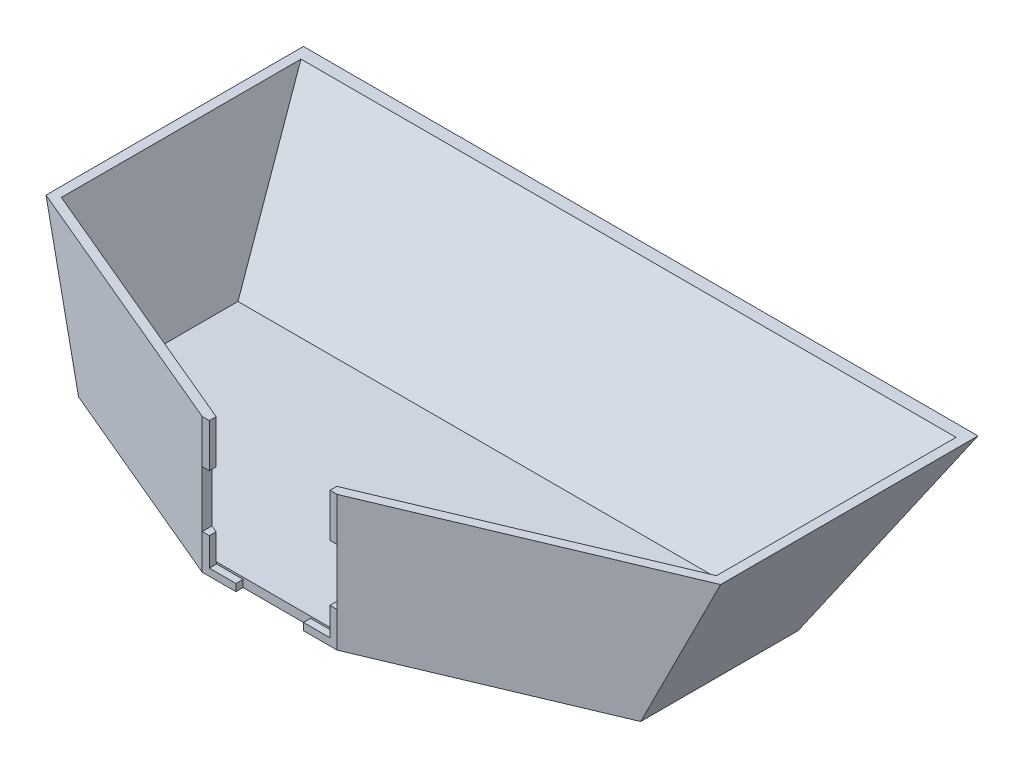
ISO-10303-21;
HEADER;
FILE_DESCRIPTION(('STEP AP214'),'2;1');
FILE_NAME('part.step','',(''),(''),'','','');
FILE_SCHEMA(('AUTOMOTIVE_DESIGN { 1 0 10303 214 1 1 1 1 }'));
ENDSEC;
DATA;
#1=APPLICATION_CONTEXT('core data for automotive mechanical design processes');
#2=APPLICATION_PROTOCOL_DEFINITION('international standard','automotive_design',2000,#1);
#3=PRODUCT_CONTEXT('',#1,'mechanical');
#4=PRODUCT('Part','Part','',(#3));
#5=PRODUCT_RELATED_PRODUCT_CATEGORY('part','',(#4));
#6=PRODUCT_DEFINITION_FORMATION('','',#4);
#7=PRODUCT_DEFINITION_CONTEXT('part definition',#1,'design');
#8=PRODUCT_DEFINITION('design','',#6,#7);
#9=PRODUCT_DEFINITION_SHAPE('','',#8);
#10=(LENGTH_UNIT() NAMED_UNIT(*) SI_UNIT(.MILLI.,.METRE.));
#11=(NAMED_UNIT(*) PLANE_ANGLE_UNIT() SI_UNIT($,.RADIAN.));
#12=(NAMED_UNIT(*) SI_UNIT($,.STERADIAN.) SOLID_ANGLE_UNIT());
#13=UNCERTAINTY_MEASURE_WITH_UNIT(LENGTH_MEASURE(1.E-05),#10,'distance_accuracy_value','');
#14=(GEOMETRIC_REPRESENTATION_CONTEXT(3) GLOBAL_UNCERTAINTY_ASSIGNED_CONTEXT((#13)) GLOBAL_UNIT_ASSIGNED_CONTEXT((#10,
#11,#12)) REPRESENTATION_CONTEXT('',''));
#15=CARTESIAN_POINT('',(0.,0.,0.));
#16=DIRECTION('',(0.,0.,1.));
#17=DIRECTION('',(1.,0.,0.));
#18=AXIS2_PLACEMENT_3D('',#15,#16,#17);
#19=CARTESIAN_POINT('',(0.,0.,75.));
#20=DIRECTION('',(0.,0.,1.));
#21=DIRECTION('',(1.,0.,0.));
#22=AXIS2_PLACEMENT_3D('',#19,#20,#21);
#23=PLANE('',#22);
#24=DIRECTION('',(-1.,0.,0.));
#25=VECTOR('',#24,1.);
#26=CARTESIAN_POINT('',(-26.825,40.675,75.));
#27=LINE('',#26,#25);
#28=CARTESIAN_POINT('',(-26.825,40.675,75.));
#29=VERTEX_POINT('',#28);
#30=CARTESIAN_POINT('',(-30.,40.675,75.));
#31=VERTEX_POINT('',#30);
#32=EDGE_CURVE('E338',#29,#31,#27,.T.);
#33=ORIENTED_EDGE('',*,*,#32,.F.);
#34=DIRECTION('',(0.,-1.,0.));
#35=VECTOR('',#34,1.);
#36=CARTESIAN_POINT('',(-26.825,40.675,75.));
#37=LINE('',#36,#35);
#38=CARTESIAN_POINT('',(-26.825,60.,75.));
#39=VERTEX_POINT('',#38);
#40=EDGE_CURVE('E343',#39,#29,#37,.T.);
#41=ORIENTED_EDGE('',*,*,#40,.F.);
#42=DIRECTION('',(1.,0.,0.));
#43=VECTOR('',#42,1.);
#44=CARTESIAN_POINT('',(-30.,60.,75.));
#45=LINE('',#44,#43);
#46=CARTESIAN_POINT('',(-30.,60.,75.));
#47=VERTEX_POINT('',#46);
#48=EDGE_CURVE('E670',#47,#39,#45,.T.);
#49=ORIENTED_EDGE('',*,*,#48,.F.);
#50=DIRECTION('',(0.,-1.,0.));
#51=VECTOR('',#50,1.);
#52=CARTESIAN_POINT('',(-30.,60.,75.));
#53=LINE('',#52,#51);
#54=EDGE_CURVE('E472',#47,#31,#53,.T.);
#55=ORIENTED_EDGE('',*,*,#54,.T.);
#56=EDGE_LOOP('',(#33,#41,#49,#55));
#57=FACE_BOUND('',#56,.T.);
#58=ADVANCED_FACE('F53',(#57),#23,.T.);
#59=DIRECTION('',(0.,1.,0.));
#60=VECTOR('',#59,1.);
#61=CARTESIAN_POINT('',(26.825,40.675,75.));
#62=LINE('',#61,#60);
#63=CARTESIAN_POINT('',(26.825,40.675,75.));
#64=VERTEX_POINT('',#63);
#65=CARTESIAN_POINT('',(26.825,60.,75.));
#66=VERTEX_POINT('',#65);
#67=EDGE_CURVE('E337',#64,#66,#62,.T.);
#68=ORIENTED_EDGE('',*,*,#67,.F.);
#69=DIRECTION('',(-1.,0.,0.));
#70=VECTOR('',#69,1.);
#71=CARTESIAN_POINT('',(26.825,40.675,75.));
#72=LINE('',#71,#70);
#73=CARTESIAN_POINT('',(30.,40.675,75.));
#74=VERTEX_POINT('',#73);
#75=EDGE_CURVE('E333',#74,#64,#72,.T.);
#76=ORIENTED_EDGE('',*,*,#75,.F.);
#77=DIRECTION('',(0.,-1.,0.));
#78=VECTOR('',#77,1.);
#79=CARTESIAN_POINT('',(30.,60.,75.));
#80=LINE('',#79,#78);
#81=CARTESIAN_POINT('',(30.,60.,75.));
#82=VERTEX_POINT('',#81);
#83=EDGE_CURVE('E473',#82,#74,#80,.T.);
#84=ORIENTED_EDGE('',*,*,#83,.F.);
#85=EDGE_CURVE('E58',#66,#82,#45,.T.);
#86=ORIENTED_EDGE('',*,*,#85,.F.);
#87=EDGE_LOOP('',(#68,#76,#84,#86));
#88=FACE_BOUND('',#87,.T.);
#89=ADVANCED_FACE('F859',(#88),#23,.T.);
#90=DIRECTION('',(1.,0.,0.));
#91=VECTOR('',#90,1.);
#92=CARTESIAN_POINT('',(26.825,15.675,75.));
#93=LINE('',#92,#91);
#94=CARTESIAN_POINT('',(26.825,15.675,75.));
#95=VERTEX_POINT('',#94);
#96=CARTESIAN_POINT('',(30.,15.675,75.));
#97=VERTEX_POINT('',#96);
#98=EDGE_CURVE('E264',#95,#97,#93,.T.);
#99=ORIENTED_EDGE('',*,*,#98,.F.);
#100=DIRECTION('',(0.,1.,0.));
#101=VECTOR('',#100,1.);
#102=CARTESIAN_POINT('',(26.825,3.175,75.));
#103=LINE('',#102,#101);
#104=CARTESIAN_POINT('',(26.825,3.175,75.));
#105=VERTEX_POINT('',#104);
#106=EDGE_CURVE('E323',#105,#95,#103,.T.);
#107=ORIENTED_EDGE('',*,*,#106,.F.);
#108=DIRECTION('',(1.,0.,0.));
#109=VECTOR('',#108,1.);
#110=CARTESIAN_POINT('',(15.,3.175,75.));
#111=LINE('',#110,#109);
#112=CARTESIAN_POINT('',(15.,3.175,75.));
#113=VERTEX_POINT('',#112);
#114=EDGE_CURVE('E319',#113,#105,#111,.T.);
#115=ORIENTED_EDGE('',*,*,#114,.F.);
#116=DIRECTION('',(0.,1.,0.));
#117=VECTOR('',#116,1.);
#118=CARTESIAN_POINT('',(15.,0.,75.));
#119=LINE('',#118,#117);
#120=CARTESIAN_POINT('',(15.,0.,75.));
#121=VERTEX_POINT('',#120);
#122=EDGE_CURVE('E324',#121,#113,#119,.T.);
#123=ORIENTED_EDGE('',*,*,#122,.F.);
#124=DIRECTION('',(1.,0.,0.));
#125=VECTOR('',#124,1.);
#126=CARTESIAN_POINT('',(-30.,0.,75.));
#127=LINE('',#126,#125);
#128=CARTESIAN_POINT('',(30.0000000000001,0.,75.));
#129=VERTEX_POINT('',#128);
#130=EDGE_CURVE('E726',#121,#129,#127,.T.);
#131=ORIENTED_EDGE('',*,*,#130,.T.);
#132=EDGE_CURVE('E578',#97,#129,#80,.T.);
#133=ORIENTED_EDGE('',*,*,#132,.F.);
#134=EDGE_LOOP('',(#99,#107,#115,#123,#131,#133));
#135=FACE_BOUND('',#134,.T.);
#136=ADVANCED_FACE('F863',(#135),#23,.T.);
#137=CARTESIAN_POINT('',(0.,0.,0.));
#138=DIRECTION('',(0.,1.,0.));
#139=DIRECTION('',(0.,0.,1.));
#140=AXIS2_PLACEMENT_3D('',#137,#138,#139);
#141=PLANE('',#140);
#142=ORIENTED_EDGE('',*,*,#130,.F.);
#143=DIRECTION('',(0.,0.,1.));
#144=VECTOR('',#143,1.);
#145=CARTESIAN_POINT('',(15.,0.,71.825));
#146=LINE('',#145,#144);
#147=CARTESIAN_POINT('',(15.,0.,71.825));
#148=VERTEX_POINT('',#147);
#149=EDGE_CURVE('E378',#148,#121,#146,.T.);
#150=ORIENTED_EDGE('',*,*,#149,.F.);
#151=DIRECTION('',(1.,0.,0.));
#152=VECTOR('',#151,1.);
#153=CARTESIAN_POINT('',(-15.,0.,71.825));
#154=LINE('',#153,#152);
#155=CARTESIAN_POINT('',(-15.,0.,71.825));
#156=VERTEX_POINT('',#155);
#157=EDGE_CURVE('E294',#156,#148,#154,.T.);
#158=ORIENTED_EDGE('',*,*,#157,.F.);
#159=DIRECTION('',(0.,0.,1.));
#160=VECTOR('',#159,1.);
#161=CARTESIAN_POINT('',(-15.,0.,71.825));
#162=LINE('',#161,#160);
#163=CARTESIAN_POINT('',(-15.,0.,75.));
#164=VERTEX_POINT('',#163);
#165=EDGE_CURVE('E382',#156,#164,#162,.T.);
#166=ORIENTED_EDGE('',*,*,#165,.T.);
#167=CARTESIAN_POINT('',(-30.,0.,75.));
#168=VERTEX_POINT('',#167);
#169=EDGE_CURVE('E614',#168,#164,#127,.T.);
#170=ORIENTED_EDGE('',*,*,#169,.F.);
#171=DIRECTION('',(0.921635375138065,0.,0.388057000058133));
#172=VECTOR('',#171,1.);
#173=CARTESIAN_POINT('',(-125.,0.,35.));
#174=LINE('',#173,#172);
#175=CARTESIAN_POINT('',(-125.,0.,35.));
#176=VERTEX_POINT('',#175);
#177=EDGE_CURVE('E73',#176,#168,#174,.T.);
#178=ORIENTED_EDGE('',*,*,#177,.F.);
#179=DIRECTION('',(0.,0.,1.));
#180=VECTOR('',#179,1.);
#181=CARTESIAN_POINT('',(-125.,0.,35.));
#182=LINE('',#181,#180);
#183=CARTESIAN_POINT('',(-125.,0.,-35.));
#184=VERTEX_POINT('',#183);
#185=EDGE_CURVE('E831',#184,#176,#182,.T.);
#186=ORIENTED_EDGE('',*,*,#185,.F.);
#187=DIRECTION('',(-1.,0.,0.));
#188=VECTOR('',#187,1.);
#189=CARTESIAN_POINT('',(125.,0.,-35.));
#190=LINE('',#189,#188);
#191=CARTESIAN_POINT('',(125.,0.,-35.));
#192=VERTEX_POINT('',#191);
#193=EDGE_CURVE('E526',#192,#184,#190,.T.);
#194=ORIENTED_EDGE('',*,*,#193,.F.);
#195=DIRECTION('',(0.,0.,-1.));
#196=VECTOR('',#195,1.);
#197=CARTESIAN_POINT('',(125.,0.,35.));
#198=LINE('',#197,#196);
#199=CARTESIAN_POINT('',(125.,0.,35.));
#200=VERTEX_POINT('',#199);
#201=EDGE_CURVE('E750',#200,#192,#198,.T.);
#202=ORIENTED_EDGE('',*,*,#201,.F.);
#203=DIRECTION('',(0.921635375138065,0.,-0.388057000058133));
#204=VECTOR('',#203,1.);
#205=CARTESIAN_POINT('',(125.,0.,35.));
#206=LINE('',#205,#204);
#207=EDGE_CURVE('E744',#129,#200,#206,.T.);
#208=ORIENTED_EDGE('',*,*,#207,.F.);
#209=EDGE_LOOP('',(#142,#150,#158,#166,#170,#178,#186,#194,#202,#208));
#210=FACE_BOUND('',#209,.T.);
#211=ADVANCED_FACE('F55',(#210),#141,.F.);
#212=CARTESIAN_POINT('',(0.,60.,0.));
#213=DIRECTION('',(0.,1.,0.));
#214=DIRECTION('',(0.,0.,1.));
#215=AXIS2_PLACEMENT_3D('',#212,#213,#214);
#216=PLANE('',#215);
#217=DIRECTION('',(0.,0.,1.));
#218=VECTOR('',#217,1.);
#219=CARTESIAN_POINT('',(-26.825,60.,71.825));
#220=LINE('',#219,#218);
#221=CARTESIAN_POINT('',(-26.825,60.,71.9967309204025));
#222=VERTEX_POINT('',#221);
#223=EDGE_CURVE('E363',#222,#39,#220,.T.);
#224=ORIENTED_EDGE('',*,*,#223,.F.);
#225=DIRECTION('',(0.921635375138065,0.,0.388057000058133));
#226=VECTOR('',#225,1.);
#227=CARTESIAN_POINT('',(-29.7889484703557,60.,70.7487526170948));
#228=LINE('',#227,#226);
#229=CARTESIAN_POINT('',(-145.666666666667,60.,21.9581344291744));
#230=VERTEX_POINT('',#229);
#231=EDGE_CURVE('E418',#230,#222,#228,.T.);
#232=ORIENTED_EDGE('',*,*,#231,.F.);
#233=DIRECTION('',(0.,0.,1.));
#234=VECTOR('',#233,1.);
#235=CARTESIAN_POINT('',(-145.666666666667,60.,0.));
#236=LINE('',#235,#234);
#237=CARTESIAN_POINT('',(-145.666666666667,60.,-84.5737264679667));
#238=VERTEX_POINT('',#237);
#239=EDGE_CURVE('E437',#238,#230,#236,.T.);
#240=ORIENTED_EDGE('',*,*,#239,.F.);
#241=DIRECTION('',(-1.,0.,0.));
#242=VECTOR('',#241,1.);
#243=CARTESIAN_POINT('',(0.,60.,-84.5737264679667));
#244=LINE('',#243,#242);
#245=CARTESIAN_POINT('',(145.666666666667,60.,-84.5737264679668));
#246=VERTEX_POINT('',#245);
#247=EDGE_CURVE('E433',#246,#238,#244,.T.);
#248=ORIENTED_EDGE('',*,*,#247,.F.);
#249=DIRECTION('',(0.,0.,-1.));
#250=VECTOR('',#249,1.);
#251=CARTESIAN_POINT('',(145.666666666667,60.,0.));
#252=LINE('',#251,#250);
#253=CARTESIAN_POINT('',(145.666666666667,60.,21.9581344291744));
#254=VERTEX_POINT('',#253);
#255=EDGE_CURVE('E429',#254,#246,#252,.T.);
#256=ORIENTED_EDGE('',*,*,#255,.F.);
#257=DIRECTION('',(0.921635375138065,0.,-0.388057000058133));
#258=VECTOR('',#257,1.);
#259=CARTESIAN_POINT('',(29.7889484703557,60.,70.7487526170948));
#260=LINE('',#259,#258);
#261=CARTESIAN_POINT('',(26.825,60.,71.9967309204025));
#262=VERTEX_POINT('',#261);
#263=EDGE_CURVE('E394',#262,#254,#260,.T.);
#264=ORIENTED_EDGE('',*,*,#263,.F.);
#265=DIRECTION('',(0.,0.,1.));
#266=VECTOR('',#265,1.);
#267=CARTESIAN_POINT('',(26.825,60.,71.825));
#268=LINE('',#267,#266);
#269=EDGE_CURVE('E367',#262,#66,#268,.T.);
#270=ORIENTED_EDGE('',*,*,#269,.T.);
#271=ORIENTED_EDGE('',*,*,#85,.T.);
#272=DIRECTION('',(0.921635375138065,0.,-0.388057000058133));
#273=VECTOR('',#272,1.);
#274=CARTESIAN_POINT('',(30.,60.,75.));
#275=LINE('',#274,#273);
#276=CARTESIAN_POINT('',(150.,60.,24.4736842105263));
#277=VERTEX_POINT('',#276);
#278=EDGE_CURVE('E586',#82,#277,#275,.T.);
#279=ORIENTED_EDGE('',*,*,#278,.T.);
#280=DIRECTION('',(0.,0.,-1.));
#281=VECTOR('',#280,1.);
#282=CARTESIAN_POINT('',(150.,60.,24.4736842105263));
#283=LINE('',#282,#281);
#284=CARTESIAN_POINT('',(150.,60.,-90.));
#285=VERTEX_POINT('',#284);
#286=EDGE_CURVE('E566',#277,#285,#283,.T.);
#287=ORIENTED_EDGE('',*,*,#286,.T.);
#288=DIRECTION('',(-1.,0.,0.));
#289=VECTOR('',#288,1.);
#290=CARTESIAN_POINT('',(-150.,60.,-90.));
#291=LINE('',#290,#289);
#292=CARTESIAN_POINT('',(-150.,60.,-90.));
#293=VERTEX_POINT('',#292);
#294=EDGE_CURVE('E647',#285,#293,#291,.T.);
#295=ORIENTED_EDGE('',*,*,#294,.T.);
#296=DIRECTION('',(0.,0.,1.));
#297=VECTOR('',#296,1.);
#298=CARTESIAN_POINT('',(-150.,60.,24.4736842105264));
#299=LINE('',#298,#297);
#300=CARTESIAN_POINT('',(-150.,60.,24.4736842105264));
#301=VERTEX_POINT('',#300);
#302=EDGE_CURVE('E486',#293,#301,#299,.T.);
#303=ORIENTED_EDGE('',*,*,#302,.T.);
#304=DIRECTION('',(0.921635375138065,0.,0.388057000058133));
#305=VECTOR('',#304,1.);
#306=CARTESIAN_POINT('',(-30.,60.,75.));
#307=LINE('',#306,#305);
#308=EDGE_CURVE('E629',#301,#47,#307,.T.);
#309=ORIENTED_EDGE('',*,*,#308,.T.);
#310=ORIENTED_EDGE('',*,*,#48,.T.);
#311=EDGE_LOOP('',(#224,#232,#240,#248,#256,#264,#270,#271,#279,#287,#295,#303,#309,#310));
#312=FACE_BOUND('',#311,.T.);
#313=ADVANCED_FACE('F505',(#312),#216,.T.);
#314=CARTESIAN_POINT('',(-106.508875739645,-44.3786982248521,0.));
#315=DIRECTION('',(-0.923076923076923,-0.384615384615385,0.));
#316=DIRECTION('',(0.384615384615385,-0.923076923076923,0.));
#317=AXIS2_PLACEMENT_3D('',#314,#315,#316);
#318=PLANE('',#317);
#319=DIRECTION('',(0.293610109757352,-0.704664263417644,0.645942241466174));
#320=VECTOR('',#319,1.);
#321=CARTESIAN_POINT('',(-150.,60.,-90.));
#322=LINE('',#321,#320);
#323=EDGE_CURVE('E492',#293,#184,#322,.T.);
#324=ORIENTED_EDGE('',*,*,#323,.T.);
#325=ORIENTED_EDGE('',*,*,#185,.T.);
#326=DIRECTION('',(0.379669072789938,-0.91120577469585,0.159860662227342));
#327=VECTOR('',#326,1.);
#328=CARTESIAN_POINT('',(-150.,60.,24.4736842105264));
#329=LINE('',#328,#327);
#330=EDGE_CURVE('E558',#301,#176,#329,.T.);
#331=ORIENTED_EDGE('',*,*,#330,.F.);
#332=ORIENTED_EDGE('',*,*,#302,.F.);
#333=EDGE_LOOP('',(#324,#325,#331,#332));
#334=FACE_BOUND('',#333,.T.);
#335=ADVANCED_FACE('F494',(#334),#318,.T.);
#336=CARTESIAN_POINT('',(-31.3411764705882,0.,74.4352941176471));
#337=DIRECTION('',(-0.388057000058133,0.,0.921635375138065));
#338=DIRECTION('',(0.921635375138065,0.,0.388057000058133));
#339=AXIS2_PLACEMENT_3D('',#336,#337,#338);
#340=PLANE('',#339);
#341=ORIENTED_EDGE('',*,*,#330,.T.);
#342=ORIENTED_EDGE('',*,*,#177,.T.);
#343=CARTESIAN_POINT('',(-30.,15.675,75.));
#344=VERTEX_POINT('',#343);
#345=EDGE_CURVE('E82',#344,#168,#53,.T.);
#346=ORIENTED_EDGE('',*,*,#345,.F.);
#347=DIRECTION('',(0.,-1.,0.));
#348=VECTOR('',#347,1.);
#349=CARTESIAN_POINT('',(-30.,15.675,75.));
#350=LINE('',#349,#348);
#351=EDGE_CURVE('E342',#31,#344,#350,.T.);
#352=ORIENTED_EDGE('',*,*,#351,.F.);
#353=ORIENTED_EDGE('',*,*,#54,.F.);
#354=ORIENTED_EDGE('',*,*,#308,.F.);
#355=EDGE_LOOP('',(#341,#342,#346,#352,#353,#354));
#356=FACE_BOUND('',#355,.T.);
#357=ADVANCED_FACE('F504',(#356),#340,.T.);
#358=CARTESIAN_POINT('',(0.,-17.4339622641509,-19.0188679245283));
#359=DIRECTION('',(0.,-0.675724628517346,-0.737154140200742));
#360=DIRECTION('',(0.,0.737154140200742,-0.675724628517346));
#361=AXIS2_PLACEMENT_3D('',#358,#359,#360);
#362=PLANE('',#361);
#363=DIRECTION('',(-0.293610109757351,-0.704664263417644,0.645942241466174));
#364=VECTOR('',#363,1.);
#365=CARTESIAN_POINT('',(150.,60.,-90.));
#366=LINE('',#365,#364);
#367=EDGE_CURVE('E549',#285,#192,#366,.T.);
#368=ORIENTED_EDGE('',*,*,#367,.T.);
#369=ORIENTED_EDGE('',*,*,#193,.T.);
#370=ORIENTED_EDGE('',*,*,#323,.F.);
#371=ORIENTED_EDGE('',*,*,#294,.F.);
#372=EDGE_LOOP('',(#368,#369,#370,#371));
#373=FACE_BOUND('',#372,.T.);
#374=ADVANCED_FACE('F531',(#373),#362,.T.);
#375=CARTESIAN_POINT('',(106.508875739645,-44.3786982248521,0.));
#376=DIRECTION('',(0.923076923076923,-0.384615384615385,0.));
#377=DIRECTION('',(0.384615384615385,0.923076923076923,0.));
#378=AXIS2_PLACEMENT_3D('',#375,#376,#377);
#379=PLANE('',#378);
#380=DIRECTION('',(-0.379669072789938,-0.91120577469585,0.159860662227343));
#381=VECTOR('',#380,1.);
#382=CARTESIAN_POINT('',(150.,60.,24.4736842105263));
#383=LINE('',#382,#381);
#384=EDGE_CURVE('E557',#277,#200,#383,.T.);
#385=ORIENTED_EDGE('',*,*,#384,.T.);
#386=ORIENTED_EDGE('',*,*,#201,.T.);
#387=ORIENTED_EDGE('',*,*,#367,.F.);
#388=ORIENTED_EDGE('',*,*,#286,.F.);
#389=EDGE_LOOP('',(#385,#386,#387,#388));
#390=FACE_BOUND('',#389,.T.);
#391=ADVANCED_FACE('F540',(#390),#379,.T.);
#392=CARTESIAN_POINT('',(31.3411764705883,0.,74.4352941176471));
#393=DIRECTION('',(0.388057000058133,0.,0.921635375138065));
#394=DIRECTION('',(0.921635375138065,0.,-0.388057000058133));
#395=AXIS2_PLACEMENT_3D('',#392,#393,#394);
#396=PLANE('',#395);
#397=ORIENTED_EDGE('',*,*,#83,.T.);
#398=DIRECTION('',(0.,1.,0.));
#399=VECTOR('',#398,1.);
#400=CARTESIAN_POINT('',(30.,15.675,75.));
#401=LINE('',#400,#399);
#402=EDGE_CURVE('E330',#97,#74,#401,.T.);
#403=ORIENTED_EDGE('',*,*,#402,.F.);
#404=ORIENTED_EDGE('',*,*,#132,.T.);
#405=ORIENTED_EDGE('',*,*,#207,.T.);
#406=ORIENTED_EDGE('',*,*,#384,.F.);
#407=ORIENTED_EDGE('',*,*,#278,.F.);
#408=EDGE_LOOP('',(#397,#403,#404,#405,#406,#407));
#409=FACE_BOUND('',#408,.T.);
#410=ADVANCED_FACE('F592',(#409),#396,.T.);
#411=DIRECTION('',(1.,0.,0.));
#412=VECTOR('',#411,1.);
#413=CARTESIAN_POINT('',(-26.825,15.675,75.));
#414=LINE('',#413,#412);
#415=CARTESIAN_POINT('',(-26.825,15.675,75.));
#416=VERTEX_POINT('',#415);
#417=EDGE_CURVE('E286',#344,#416,#414,.T.);
#418=ORIENTED_EDGE('',*,*,#417,.F.);
#419=ORIENTED_EDGE('',*,*,#345,.T.);
#420=ORIENTED_EDGE('',*,*,#169,.T.);
#421=DIRECTION('',(0.,-1.,0.));
#422=VECTOR('',#421,1.);
#423=CARTESIAN_POINT('',(-15.,0.,75.));
#424=LINE('',#423,#422);
#425=CARTESIAN_POINT('',(-15.,3.175,75.));
#426=VERTEX_POINT('',#425);
#427=EDGE_CURVE('E318',#426,#164,#424,.T.);
#428=ORIENTED_EDGE('',*,*,#427,.F.);
#429=DIRECTION('',(1.,0.,0.));
#430=VECTOR('',#429,1.);
#431=CARTESIAN_POINT('',(-26.825,3.175,75.));
#432=LINE('',#431,#430);
#433=CARTESIAN_POINT('',(-26.825,3.175,75.));
#434=VERTEX_POINT('',#433);
#435=EDGE_CURVE('E314',#434,#426,#432,.T.);
#436=ORIENTED_EDGE('',*,*,#435,.F.);
#437=DIRECTION('',(0.,-1.,0.));
#438=VECTOR('',#437,1.);
#439=CARTESIAN_POINT('',(-26.825,3.175,75.));
#440=LINE('',#439,#438);
#441=EDGE_CURVE('E279',#416,#434,#440,.T.);
#442=ORIENTED_EDGE('',*,*,#441,.F.);
#443=EDGE_LOOP('',(#418,#419,#420,#428,#436,#442));
#444=FACE_BOUND('',#443,.T.);
#445=ADVANCED_FACE('F600',(#444),#23,.T.);
#446=CARTESIAN_POINT('',(0.,4.,0.));
#447=DIRECTION('',(0.,1.,0.));
#448=DIRECTION('',(0.,0.,1.));
#449=AXIS2_PLACEMENT_3D('',#446,#447,#448);
#450=PLANE('',#449);
#451=DIRECTION('',(0.,0.,1.));
#452=VECTOR('',#451,1.);
#453=CARTESIAN_POINT('',(-26.825,4.,0.));
#454=LINE('',#453,#452);
#455=CARTESIAN_POINT('',(-26.825,4.,71.825));
#456=VERTEX_POINT('',#455);
#457=CARTESIAN_POINT('',(-26.825,4.,71.9967309204025));
#458=VERTEX_POINT('',#457);
#459=EDGE_CURVE('E391',#456,#458,#454,.T.);
#460=ORIENTED_EDGE('',*,*,#459,.F.);
#461=DIRECTION('',(1.,0.,0.));
#462=VECTOR('',#461,1.);
#463=CARTESIAN_POINT('',(0.,4.,71.825));
#464=LINE('',#463,#462);
#465=CARTESIAN_POINT('',(26.825,4.,71.825));
#466=VERTEX_POINT('',#465);
#467=EDGE_CURVE('E353',#456,#466,#464,.T.);
#468=ORIENTED_EDGE('',*,*,#467,.T.);
#469=DIRECTION('',(0.,0.,-1.));
#470=VECTOR('',#469,1.);
#471=CARTESIAN_POINT('',(26.825,4.,0.));
#472=LINE('',#471,#470);
#473=CARTESIAN_POINT('',(26.825,4.,71.9967309204025));
#474=VERTEX_POINT('',#473);
#475=EDGE_CURVE('E388',#474,#466,#472,.T.);
#476=ORIENTED_EDGE('',*,*,#475,.F.);
#477=DIRECTION('',(0.921635375138065,0.,-0.388057000058133));
#478=VECTOR('',#477,1.);
#479=CARTESIAN_POINT('',(29.7889484703558,4.,70.7487526170949));
#480=LINE('',#479,#478);
#481=CARTESIAN_POINT('',(122.333333333333,4.,31.7826958326832));
#482=VERTEX_POINT('',#481);
#483=EDGE_CURVE('E406',#474,#482,#480,.T.);
#484=ORIENTED_EDGE('',*,*,#483,.T.);
#485=DIRECTION('',(0.,0.,-1.));
#486=VECTOR('',#485,1.);
#487=CARTESIAN_POINT('',(122.333333333333,4.,0.));
#488=LINE('',#487,#486);
#489=CARTESIAN_POINT('',(122.333333333333,4.,-33.2403931346334));
#490=VERTEX_POINT('',#489);
#491=EDGE_CURVE('E403',#482,#490,#488,.T.);
#492=ORIENTED_EDGE('',*,*,#491,.T.);
#493=DIRECTION('',(-1.,0.,0.));
#494=VECTOR('',#493,1.);
#495=CARTESIAN_POINT('',(0.,4.,-33.2403931346334));
#496=LINE('',#495,#494);
#497=CARTESIAN_POINT('',(-122.333333333333,4.,-33.2403931346334));
#498=VERTEX_POINT('',#497);
#499=EDGE_CURVE('E399',#490,#498,#496,.T.);
#500=ORIENTED_EDGE('',*,*,#499,.T.);
#501=DIRECTION('',(0.,0.,1.));
#502=VECTOR('',#501,1.);
#503=CARTESIAN_POINT('',(-122.333333333333,4.,0.));
#504=LINE('',#503,#502);
#505=CARTESIAN_POINT('',(-122.333333333333,4.,31.7826958326832));
#506=VERTEX_POINT('',#505);
#507=EDGE_CURVE('E395',#498,#506,#504,.T.);
#508=ORIENTED_EDGE('',*,*,#507,.T.);
#509=DIRECTION('',(0.921635375138065,0.,0.388057000058133));
#510=VECTOR('',#509,1.);
#511=CARTESIAN_POINT('',(-29.7889484703557,4.,70.7487526170948));
#512=LINE('',#511,#510);
#513=EDGE_CURVE('E409',#506,#458,#512,.T.);
#514=ORIENTED_EDGE('',*,*,#513,.T.);
#515=EDGE_LOOP('',(#460,#468,#476,#484,#492,#500,#508,#514));
#516=FACE_BOUND('',#515,.T.);
#517=ADVANCED_FACE('F865',(#516),#450,.T.);
#518=CARTESIAN_POINT('',(-102.816568047337,-42.8402366863905,0.));
#519=DIRECTION('',(-0.923076923076923,-0.384615384615385,0.));
#520=DIRECTION('',(0.384615384615385,-0.923076923076923,0.));
#521=AXIS2_PLACEMENT_3D('',#518,#519,#520);
#522=PLANE('',#521);
#523=DIRECTION('',(0.293610109757352,-0.704664263417644,0.645942241466174));
#524=VECTOR('',#523,1.);
#525=CARTESIAN_POINT('',(-104.655557623891,-38.4266617026607,5.65071342613892));
#526=LINE('',#525,#524);
#527=EDGE_CURVE('E413',#238,#498,#526,.T.);
#528=ORIENTED_EDGE('',*,*,#527,.F.);
#529=ORIENTED_EDGE('',*,*,#239,.T.);
#530=DIRECTION('',(0.379669072789938,-0.91120577469585,0.159860662227342));
#531=VECTOR('',#530,1.);
#532=CARTESIAN_POINT('',(-105.244351091657,-37.0135573800241,38.9780567765471));
#533=LINE('',#532,#531);
#534=EDGE_CURVE('E417',#230,#506,#533,.T.);
#535=ORIENTED_EDGE('',*,*,#534,.T.);
#536=ORIENTED_EDGE('',*,*,#507,.F.);
#537=EDGE_LOOP('',(#528,#529,#535,#536));
#538=FACE_BOUND('',#537,.T.);
#539=ADVANCED_FACE('F869',(#538),#522,.F.);
#540=CARTESIAN_POINT('',(-29.7889484703557,0.,70.7487526170948));
#541=DIRECTION('',(-0.388057000058133,0.,0.921635375138065));
#542=DIRECTION('',(0.921635375138065,0.,0.388057000058133));
#543=AXIS2_PLACEMENT_3D('',#540,#541,#542);
#544=PLANE('',#543);
#545=DIRECTION('',(0.,-1.,0.));
#546=VECTOR('',#545,1.);
#547=CARTESIAN_POINT('',(-30.,0.,70.6598888151393));
#548=LINE('',#547,#546);
#549=CARTESIAN_POINT('',(-30.,40.675,70.6598888151393));
#550=VERTEX_POINT('',#549);
#551=CARTESIAN_POINT('',(-30.,15.675,70.6598888151393));
#552=VERTEX_POINT('',#551);
#553=EDGE_CURVE('E275',#550,#552,#548,.T.);
#554=ORIENTED_EDGE('',*,*,#553,.T.);
#555=DIRECTION('',(0.921635375138065,0.,0.388057000058133));
#556=VECTOR('',#555,1.);
#557=CARTESIAN_POINT('',(-29.7889484703557,15.675,70.7487526170948));
#558=LINE('',#557,#556);
#559=CARTESIAN_POINT('',(-26.825,15.675,71.9967309204025));
#560=VERTEX_POINT('',#559);
#561=EDGE_CURVE('E462',#552,#560,#558,.T.);
#562=ORIENTED_EDGE('',*,*,#561,.T.);
#563=DIRECTION('',(0.,-1.,0.));
#564=VECTOR('',#563,1.);
#565=CARTESIAN_POINT('',(-26.825,0.,71.9967309204025));
#566=LINE('',#565,#564);
#567=EDGE_CURVE('E65',#560,#458,#566,.T.);
#568=ORIENTED_EDGE('',*,*,#567,.T.);
#569=ORIENTED_EDGE('',*,*,#513,.F.);
#570=ORIENTED_EDGE('',*,*,#534,.F.);
#571=ORIENTED_EDGE('',*,*,#231,.T.);
#572=DIRECTION('',(0.,-1.,0.));
#573=VECTOR('',#572,1.);
#574=CARTESIAN_POINT('',(-26.825,0.,71.9967309204025));
#575=LINE('',#574,#573);
#576=CARTESIAN_POINT('',(-26.825,40.675,71.9967309204025));
#577=VERTEX_POINT('',#576);
#578=EDGE_CURVE('E12',#222,#577,#575,.T.);
#579=ORIENTED_EDGE('',*,*,#578,.T.);
#580=DIRECTION('',(-0.921635375138065,0.,-0.388057000058133));
#581=VECTOR('',#580,1.);
#582=CARTESIAN_POINT('',(-29.7889484703557,40.675,70.7487526170948));
#583=LINE('',#582,#581);
#584=EDGE_CURVE('E459',#577,#550,#583,.T.);
#585=ORIENTED_EDGE('',*,*,#584,.T.);
#586=EDGE_LOOP('',(#554,#562,#568,#569,#570,#571,#579,#585));
#587=FACE_BOUND('',#586,.T.);
#588=ADVANCED_FACE('F820',(#587),#544,.F.);
#589=CARTESIAN_POINT('',(0.,-14.7310637500816,-16.0702513637253));
#590=DIRECTION('',(0.,-0.675724628517346,-0.737154140200742));
#591=DIRECTION('',(0.,0.737154140200742,-0.675724628517346));
#592=AXIS2_PLACEMENT_3D('',#589,#590,#591);
#593=PLANE('',#592);
#594=DIRECTION('',(-0.293610109757352,-0.704664263417644,0.645942241466174));
#595=VECTOR('',#594,1.);
#596=CARTESIAN_POINT('',(104.655557623891,-38.4266617026608,5.65071342613891));
#597=LINE('',#596,#595);
#598=EDGE_CURVE('E422',#246,#490,#597,.T.);
#599=ORIENTED_EDGE('',*,*,#598,.F.);
#600=ORIENTED_EDGE('',*,*,#247,.T.);
#601=ORIENTED_EDGE('',*,*,#527,.T.);
#602=ORIENTED_EDGE('',*,*,#499,.F.);
#603=EDGE_LOOP('',(#599,#600,#601,#602));
#604=FACE_BOUND('',#603,.T.);
#605=ADVANCED_FACE('F886',(#604),#593,.F.);
#606=CARTESIAN_POINT('',(102.816568047337,-42.8402366863906,0.));
#607=DIRECTION('',(0.923076923076923,-0.384615384615385,0.));
#608=DIRECTION('',(0.384615384615385,0.923076923076923,0.));
#609=AXIS2_PLACEMENT_3D('',#606,#607,#608);
#610=PLANE('',#609);
#611=DIRECTION('',(-0.379669072789938,-0.91120577469585,0.159860662227343));
#612=VECTOR('',#611,1.);
#613=CARTESIAN_POINT('',(105.244351091657,-37.0135573800241,38.9780567765471));
#614=LINE('',#613,#612);
#615=EDGE_CURVE('E400',#254,#482,#614,.T.);
#616=ORIENTED_EDGE('',*,*,#615,.F.);
#617=ORIENTED_EDGE('',*,*,#255,.T.);
#618=ORIENTED_EDGE('',*,*,#598,.T.);
#619=ORIENTED_EDGE('',*,*,#491,.F.);
#620=EDGE_LOOP('',(#616,#617,#618,#619));
#621=FACE_BOUND('',#620,.T.);
#622=ADVANCED_FACE('F883',(#621),#610,.F.);
#623=CARTESIAN_POINT('',(29.7889484703558,0.,70.7487526170949));
#624=DIRECTION('',(0.388057000058133,0.,0.921635375138065));
#625=DIRECTION('',(0.921635375138065,0.,-0.388057000058133));
#626=AXIS2_PLACEMENT_3D('',#623,#624,#625);
#627=PLANE('',#626);
#628=DIRECTION('',(0.,1.,0.));
#629=VECTOR('',#628,1.);
#630=CARTESIAN_POINT('',(30.,0.,70.6598888151394));
#631=LINE('',#630,#629);
#632=CARTESIAN_POINT('',(30.,15.675,70.6598888151394));
#633=VERTEX_POINT('',#632);
#634=CARTESIAN_POINT('',(30.,40.675,70.6598888151394));
#635=VERTEX_POINT('',#634);
#636=EDGE_CURVE('E252',#633,#635,#631,.T.);
#637=ORIENTED_EDGE('',*,*,#636,.T.);
#638=DIRECTION('',(-0.921635375138065,0.,0.388057000058133));
#639=VECTOR('',#638,1.);
#640=CARTESIAN_POINT('',(29.7889484703558,40.675,70.7487526170948));
#641=LINE('',#640,#639);
#642=CARTESIAN_POINT('',(26.825,40.675,71.9967309204025));
#643=VERTEX_POINT('',#642);
#644=EDGE_CURVE('E258',#635,#643,#641,.T.);
#645=ORIENTED_EDGE('',*,*,#644,.T.);
#646=DIRECTION('',(0.,1.,0.));
#647=VECTOR('',#646,1.);
#648=CARTESIAN_POINT('',(26.825,0.,71.9967309204025));
#649=LINE('',#648,#647);
#650=EDGE_CURVE('E453',#643,#262,#649,.T.);
#651=ORIENTED_EDGE('',*,*,#650,.T.);
#652=ORIENTED_EDGE('',*,*,#263,.T.);
#653=ORIENTED_EDGE('',*,*,#615,.T.);
#654=ORIENTED_EDGE('',*,*,#483,.F.);
#655=DIRECTION('',(0.,1.,0.));
#656=VECTOR('',#655,1.);
#657=CARTESIAN_POINT('',(26.825,0.,71.9967309204025));
#658=LINE('',#657,#656);
#659=CARTESIAN_POINT('',(26.825,15.675,71.9967309204025));
#660=VERTEX_POINT('',#659);
#661=EDGE_CURVE('E254',#474,#660,#658,.T.);
#662=ORIENTED_EDGE('',*,*,#661,.T.);
#663=DIRECTION('',(0.921635375138065,0.,-0.388057000058133));
#664=VECTOR('',#663,1.);
#665=CARTESIAN_POINT('',(29.7889484703557,15.675,70.7487526170949));
#666=LINE('',#665,#664);
#667=EDGE_CURVE('E247',#660,#633,#666,.T.);
#668=ORIENTED_EDGE('',*,*,#667,.T.);
#669=EDGE_LOOP('',(#637,#645,#651,#652,#653,#654,#662,#668));
#670=FACE_BOUND('',#669,.T.);
#671=ADVANCED_FACE('F249',(#670),#627,.F.);
#672=CARTESIAN_POINT('',(-26.825,15.675,71.825));
#673=DIRECTION('',(0.,-1.,0.));
#674=DIRECTION('',(1.,0.,0.));
#675=AXIS2_PLACEMENT_3D('',#672,#673,#674);
#676=PLANE('',#675);
#677=ORIENTED_EDGE('',*,*,#561,.F.);
#678=DIRECTION('',(0.,0.,1.));
#679=VECTOR('',#678,1.);
#680=CARTESIAN_POINT('',(-30.,15.675,71.825));
#681=LINE('',#680,#679);
#682=EDGE_CURVE('E354',#552,#344,#681,.T.);
#683=ORIENTED_EDGE('',*,*,#682,.T.);
#684=ORIENTED_EDGE('',*,*,#417,.T.);
#685=DIRECTION('',(0.,0.,1.));
#686=VECTOR('',#685,1.);
#687=CARTESIAN_POINT('',(-26.825,15.675,71.825));
#688=LINE('',#687,#686);
#689=EDGE_CURVE('E350',#560,#416,#688,.T.);
#690=ORIENTED_EDGE('',*,*,#689,.F.);
#691=EDGE_LOOP('',(#677,#683,#684,#690));
#692=FACE_BOUND('',#691,.T.);
#693=ADVANCED_FACE('F818',(#692),#676,.F.);
#694=CARTESIAN_POINT('',(-26.825,40.675,71.825));
#695=DIRECTION('',(0.,1.,0.));
#696=DIRECTION('',(0.,0.,1.));
#697=AXIS2_PLACEMENT_3D('',#694,#695,#696);
#698=PLANE('',#697);
#699=DIRECTION('',(0.,0.,1.));
#700=VECTOR('',#699,1.);
#701=CARTESIAN_POINT('',(-26.825,40.675,71.825));
#702=LINE('',#701,#700);
#703=EDGE_CURVE('E360',#577,#29,#702,.T.);
#704=ORIENTED_EDGE('',*,*,#703,.T.);
#705=ORIENTED_EDGE('',*,*,#32,.T.);
#706=DIRECTION('',(0.,0.,1.));
#707=VECTOR('',#706,1.);
#708=CARTESIAN_POINT('',(-30.,40.675,71.825));
#709=LINE('',#708,#707);
#710=EDGE_CURVE('E357',#550,#31,#709,.T.);
#711=ORIENTED_EDGE('',*,*,#710,.F.);
#712=ORIENTED_EDGE('',*,*,#584,.F.);
#713=EDGE_LOOP('',(#704,#705,#711,#712));
#714=FACE_BOUND('',#713,.T.);
#715=ADVANCED_FACE('F809',(#714),#698,.F.);
#716=CARTESIAN_POINT('',(-26.825,40.675,71.825));
#717=DIRECTION('',(-1.,0.,0.));
#718=DIRECTION('',(0.,0.,1.));
#719=AXIS2_PLACEMENT_3D('',#716,#717,#718);
#720=PLANE('',#719);
#721=ORIENTED_EDGE('',*,*,#223,.T.);
#722=ORIENTED_EDGE('',*,*,#40,.T.);
#723=ORIENTED_EDGE('',*,*,#703,.F.);
#724=ORIENTED_EDGE('',*,*,#578,.F.);
#725=EDGE_LOOP('',(#721,#722,#723,#724));
#726=FACE_BOUND('',#725,.T.);
#727=ADVANCED_FACE('F801',(#726),#720,.F.);
#728=CARTESIAN_POINT('',(26.825,40.675,71.825));
#729=DIRECTION('',(1.,0.,0.));
#730=DIRECTION('',(0.,0.,-1.));
#731=AXIS2_PLACEMENT_3D('',#728,#729,#730);
#732=PLANE('',#731);
#733=DIRECTION('',(0.,0.,1.));
#734=VECTOR('',#733,1.);
#735=CARTESIAN_POINT('',(26.825,40.675,71.825));
#736=LINE('',#735,#734);
#737=EDGE_CURVE('E364',#643,#64,#736,.T.);
#738=ORIENTED_EDGE('',*,*,#737,.T.);
#739=ORIENTED_EDGE('',*,*,#67,.T.);
#740=ORIENTED_EDGE('',*,*,#269,.F.);
#741=ORIENTED_EDGE('',*,*,#650,.F.);
#742=EDGE_LOOP('',(#738,#739,#740,#741));
#743=FACE_BOUND('',#742,.T.);
#744=ADVANCED_FACE('F794',(#743),#732,.F.);
#745=CARTESIAN_POINT('',(26.825,40.675,71.825));
#746=DIRECTION('',(0.,1.,0.));
#747=DIRECTION('',(0.,0.,1.));
#748=AXIS2_PLACEMENT_3D('',#745,#746,#747);
#749=PLANE('',#748);
#750=ORIENTED_EDGE('',*,*,#644,.F.);
#751=DIRECTION('',(0.,0.,1.));
#752=VECTOR('',#751,1.);
#753=CARTESIAN_POINT('',(30.,40.675,71.825));
#754=LINE('',#753,#752);
#755=EDGE_CURVE('E269',#635,#74,#754,.T.);
#756=ORIENTED_EDGE('',*,*,#755,.T.);
#757=ORIENTED_EDGE('',*,*,#75,.T.);
#758=ORIENTED_EDGE('',*,*,#737,.F.);
#759=EDGE_LOOP('',(#750,#756,#757,#758));
#760=FACE_BOUND('',#759,.T.);
#761=ADVANCED_FACE('F879',(#760),#749,.F.);
#762=CARTESIAN_POINT('',(26.825,15.675,71.825));
#763=DIRECTION('',(0.,-1.,0.));
#764=DIRECTION('',(1.,0.,0.));
#765=AXIS2_PLACEMENT_3D('',#762,#763,#764);
#766=PLANE('',#765);
#767=DIRECTION('',(0.,0.,1.));
#768=VECTOR('',#767,1.);
#769=CARTESIAN_POINT('',(26.825,15.675,71.825));
#770=LINE('',#769,#768);
#771=EDGE_CURVE('E270',#660,#95,#770,.T.);
#772=ORIENTED_EDGE('',*,*,#771,.T.);
#773=ORIENTED_EDGE('',*,*,#98,.T.);
#774=DIRECTION('',(0.,0.,1.));
#775=VECTOR('',#774,1.);
#776=CARTESIAN_POINT('',(30.,15.675,71.825));
#777=LINE('',#776,#775);
#778=EDGE_CURVE('E261',#633,#97,#777,.T.);
#779=ORIENTED_EDGE('',*,*,#778,.F.);
#780=ORIENTED_EDGE('',*,*,#667,.F.);
#781=EDGE_LOOP('',(#772,#773,#779,#780));
#782=FACE_BOUND('',#781,.T.);
#783=ADVANCED_FACE('F262',(#782),#766,.F.);
#784=CARTESIAN_POINT('',(-26.825,3.175,71.825));
#785=DIRECTION('',(-1.,0.,0.));
#786=DIRECTION('',(0.,0.,1.));
#787=AXIS2_PLACEMENT_3D('',#784,#785,#786);
#788=PLANE('',#787);
#789=ORIENTED_EDGE('',*,*,#459,.T.);
#790=ORIENTED_EDGE('',*,*,#567,.F.);
#791=ORIENTED_EDGE('',*,*,#689,.T.);
#792=ORIENTED_EDGE('',*,*,#441,.T.);
#793=DIRECTION('',(0.,0.,1.));
#794=VECTOR('',#793,1.);
#795=CARTESIAN_POINT('',(-26.825,3.175,71.825));
#796=LINE('',#795,#794);
#797=CARTESIAN_POINT('',(-26.825,3.175,71.825));
#798=VERTEX_POINT('',#797);
#799=EDGE_CURVE('E310',#798,#434,#796,.T.);
#800=ORIENTED_EDGE('',*,*,#799,.F.);
#801=DIRECTION('',(0.,-1.,0.));
#802=VECTOR('',#801,1.);
#803=CARTESIAN_POINT('',(-26.825,3.175,71.825));
#804=LINE('',#803,#802);
#805=EDGE_CURVE('E282',#456,#798,#804,.T.);
#806=ORIENTED_EDGE('',*,*,#805,.F.);
#807=EDGE_LOOP('',(#789,#790,#791,#792,#800,#806));
#808=FACE_BOUND('',#807,.T.);
#809=ADVANCED_FACE('F908',(#808),#788,.F.);
#810=CARTESIAN_POINT('',(-30.,15.675,71.825));
#811=DIRECTION('',(-1.,0.,0.));
#812=DIRECTION('',(0.,-1.,0.));
#813=AXIS2_PLACEMENT_3D('',#810,#811,#812);
#814=PLANE('',#813);
#815=ORIENTED_EDGE('',*,*,#351,.T.);
#816=ORIENTED_EDGE('',*,*,#682,.F.);
#817=ORIENTED_EDGE('',*,*,#553,.F.);
#818=ORIENTED_EDGE('',*,*,#710,.T.);
#819=EDGE_LOOP('',(#815,#816,#817,#818));
#820=FACE_BOUND('',#819,.T.);
#821=ADVANCED_FACE('F813',(#820),#814,.F.);
#822=CARTESIAN_POINT('',(30.,15.675,71.825));
#823=DIRECTION('',(1.,0.,0.));
#824=DIRECTION('',(0.,0.,-1.));
#825=AXIS2_PLACEMENT_3D('',#822,#823,#824);
#826=PLANE('',#825);
#827=ORIENTED_EDGE('',*,*,#402,.T.);
#828=ORIENTED_EDGE('',*,*,#755,.F.);
#829=ORIENTED_EDGE('',*,*,#636,.F.);
#830=ORIENTED_EDGE('',*,*,#778,.T.);
#831=EDGE_LOOP('',(#827,#828,#829,#830));
#832=FACE_BOUND('',#831,.T.);
#833=ADVANCED_FACE('F273',(#832),#826,.F.);
#834=CARTESIAN_POINT('',(26.825,3.175,71.825));
#835=DIRECTION('',(1.,0.,0.));
#836=DIRECTION('',(0.,0.,-1.));
#837=AXIS2_PLACEMENT_3D('',#834,#835,#836);
#838=PLANE('',#837);
#839=ORIENTED_EDGE('',*,*,#475,.T.);
#840=DIRECTION('',(0.,1.,0.));
#841=VECTOR('',#840,1.);
#842=CARTESIAN_POINT('',(26.825,3.175,71.825));
#843=LINE('',#842,#841);
#844=CARTESIAN_POINT('',(26.825,3.175,71.825));
#845=VERTEX_POINT('',#844);
#846=EDGE_CURVE('E306',#845,#466,#843,.T.);
#847=ORIENTED_EDGE('',*,*,#846,.F.);
#848=DIRECTION('',(0.,0.,1.));
#849=VECTOR('',#848,1.);
#850=CARTESIAN_POINT('',(26.825,3.175,71.825));
#851=LINE('',#850,#849);
#852=EDGE_CURVE('E372',#845,#105,#851,.T.);
#853=ORIENTED_EDGE('',*,*,#852,.T.);
#854=ORIENTED_EDGE('',*,*,#106,.T.);
#855=ORIENTED_EDGE('',*,*,#771,.F.);
#856=ORIENTED_EDGE('',*,*,#661,.F.);
#857=EDGE_LOOP('',(#839,#847,#853,#854,#855,#856));
#858=FACE_BOUND('',#857,.T.);
#859=ADVANCED_FACE('F893',(#858),#838,.F.);
#860=CARTESIAN_POINT('',(15.,3.175,71.825));
#861=DIRECTION('',(0.,-1.,0.));
#862=DIRECTION('',(0.,0.,-1.));
#863=AXIS2_PLACEMENT_3D('',#860,#861,#862);
#864=PLANE('',#863);
#865=ORIENTED_EDGE('',*,*,#114,.T.);
#866=ORIENTED_EDGE('',*,*,#852,.F.);
#867=DIRECTION('',(1.,0.,0.));
#868=VECTOR('',#867,1.);
#869=CARTESIAN_POINT('',(15.,3.175,71.825));
#870=LINE('',#869,#868);
#871=CARTESIAN_POINT('',(15.,3.175,71.825));
#872=VERTEX_POINT('',#871);
#873=EDGE_CURVE('E302',#872,#845,#870,.T.);
#874=ORIENTED_EDGE('',*,*,#873,.F.);
#875=DIRECTION('',(0.,0.,1.));
#876=VECTOR('',#875,1.);
#877=CARTESIAN_POINT('',(15.,3.175,71.825));
#878=LINE('',#877,#876);
#879=EDGE_CURVE('E375',#872,#113,#878,.T.);
#880=ORIENTED_EDGE('',*,*,#879,.T.);
#881=EDGE_LOOP('',(#865,#866,#874,#880));
#882=FACE_BOUND('',#881,.T.);
#883=ADVANCED_FACE('F899',(#882),#864,.F.);
#884=CARTESIAN_POINT('',(15.,0.,71.825));
#885=DIRECTION('',(1.,0.,0.));
#886=DIRECTION('',(0.,0.,-1.));
#887=AXIS2_PLACEMENT_3D('',#884,#885,#886);
#888=PLANE('',#887);
#889=ORIENTED_EDGE('',*,*,#122,.T.);
#890=ORIENTED_EDGE('',*,*,#879,.F.);
#891=DIRECTION('',(0.,1.,0.));
#892=VECTOR('',#891,1.);
#893=CARTESIAN_POINT('',(15.,0.,71.825));
#894=LINE('',#893,#892);
#895=EDGE_CURVE('E298',#148,#872,#894,.T.);
#896=ORIENTED_EDGE('',*,*,#895,.F.);
#897=ORIENTED_EDGE('',*,*,#149,.T.);
#898=EDGE_LOOP('',(#889,#890,#896,#897));
#899=FACE_BOUND('',#898,.T.);
#900=ADVANCED_FACE('F900',(#899),#888,.F.);
#901=CARTESIAN_POINT('',(-15.,0.,71.825));
#902=DIRECTION('',(-1.,0.,0.));
#903=DIRECTION('',(0.,0.,1.));
#904=AXIS2_PLACEMENT_3D('',#901,#902,#903);
#905=PLANE('',#904);
#906=ORIENTED_EDGE('',*,*,#427,.T.);
#907=ORIENTED_EDGE('',*,*,#165,.F.);
#908=DIRECTION('',(0.,-1.,0.));
#909=VECTOR('',#908,1.);
#910=CARTESIAN_POINT('',(-15.,0.,71.825));
#911=LINE('',#910,#909);
#912=CARTESIAN_POINT('',(-15.,3.175,71.825));
#913=VERTEX_POINT('',#912);
#914=EDGE_CURVE('E290',#913,#156,#911,.T.);
#915=ORIENTED_EDGE('',*,*,#914,.F.);
#916=DIRECTION('',(0.,0.,1.));
#917=VECTOR('',#916,1.);
#918=CARTESIAN_POINT('',(-15.,3.175,71.825));
#919=LINE('',#918,#917);
#920=EDGE_CURVE('E379',#913,#426,#919,.T.);
#921=ORIENTED_EDGE('',*,*,#920,.T.);
#922=EDGE_LOOP('',(#906,#907,#915,#921));
#923=FACE_BOUND('',#922,.T.);
#924=ADVANCED_FACE('F903',(#923),#905,.F.);
#925=CARTESIAN_POINT('',(-26.825,3.175,71.825));
#926=DIRECTION('',(0.,-1.,0.));
#927=DIRECTION('',(0.,0.,-1.));
#928=AXIS2_PLACEMENT_3D('',#925,#926,#927);
#929=PLANE('',#928);
#930=ORIENTED_EDGE('',*,*,#435,.T.);
#931=ORIENTED_EDGE('',*,*,#920,.F.);
#932=DIRECTION('',(1.,0.,0.));
#933=VECTOR('',#932,1.);
#934=CARTESIAN_POINT('',(-26.825,3.175,71.825));
#935=LINE('',#934,#933);
#936=EDGE_CURVE('E285',#798,#913,#935,.T.);
#937=ORIENTED_EDGE('',*,*,#936,.F.);
#938=ORIENTED_EDGE('',*,*,#799,.T.);
#939=EDGE_LOOP('',(#930,#931,#937,#938));
#940=FACE_BOUND('',#939,.T.);
#941=ADVANCED_FACE('F905',(#940),#929,.F.);
#942=CARTESIAN_POINT('',(0.,0.,71.825));
#943=DIRECTION('',(0.,0.,1.));
#944=DIRECTION('',(1.,0.,0.));
#945=AXIS2_PLACEMENT_3D('',#942,#943,#944);
#946=PLANE('',#945);
#947=ORIENTED_EDGE('',*,*,#805,.T.);
#948=ORIENTED_EDGE('',*,*,#936,.T.);
#949=ORIENTED_EDGE('',*,*,#914,.T.);
#950=ORIENTED_EDGE('',*,*,#157,.T.);
#951=ORIENTED_EDGE('',*,*,#895,.T.);
#952=ORIENTED_EDGE('',*,*,#873,.T.);
#953=ORIENTED_EDGE('',*,*,#846,.T.);
#954=ORIENTED_EDGE('',*,*,#467,.F.);
#955=EDGE_LOOP('',(#947,#948,#949,#950,#951,#952,#953,#954));
#956=FACE_BOUND('',#955,.T.);
#957=ADVANCED_FACE('F895',(#956),#946,.T.);
#958=CLOSED_SHELL('',(#58,#89,#136,#211,#313,#335,#357,#374,#391,#410,#445,#517,#539,#588,#605,
#622,#671,#693,#715,#727,#744,#761,#783,#809,#821,#833,#859,#883,#900,#924,#941,#957));
#959=MANIFOLD_SOLID_BREP('B2',#958);
#960=ADVANCED_BREP_SHAPE_REPRESENTATION('',(#18,#959),#14);
#961=SHAPE_DEFINITION_REPRESENTATION(#9,#960);
ENDSEC;
END-ISO-10303-21;
